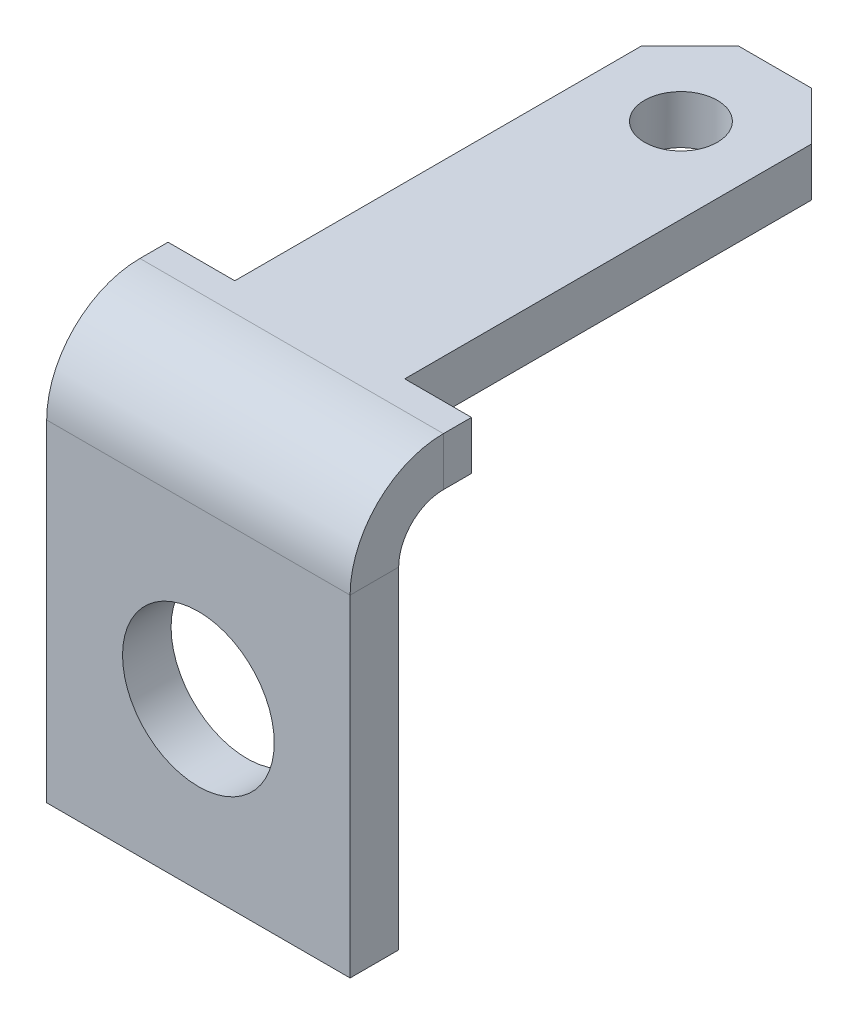
ISO-10303-21;
HEADER;
FILE_DESCRIPTION(('STEP AP214'),'2;1');
FILE_NAME('part.step','',(''),(''),'','','');
FILE_SCHEMA(('AUTOMOTIVE_DESIGN { 1 0 10303 214 1 1 1 1 }'));
ENDSEC;
DATA;
#1=APPLICATION_CONTEXT('core data for automotive mechanical design processes');
#2=APPLICATION_PROTOCOL_DEFINITION('international standard','automotive_design',2000,#1);
#3=PRODUCT_CONTEXT('',#1,'mechanical');
#4=PRODUCT('Part','Part','',(#3));
#5=PRODUCT_RELATED_PRODUCT_CATEGORY('part','',(#4));
#6=PRODUCT_DEFINITION_FORMATION('','',#4);
#7=PRODUCT_DEFINITION_CONTEXT('part definition',#1,'design');
#8=PRODUCT_DEFINITION('design','',#6,#7);
#9=PRODUCT_DEFINITION_SHAPE('','',#8);
#10=(LENGTH_UNIT() NAMED_UNIT(*) SI_UNIT(.MILLI.,.METRE.));
#11=(NAMED_UNIT(*) PLANE_ANGLE_UNIT() SI_UNIT($,.RADIAN.));
#12=(NAMED_UNIT(*) SI_UNIT($,.STERADIAN.) SOLID_ANGLE_UNIT());
#13=UNCERTAINTY_MEASURE_WITH_UNIT(LENGTH_MEASURE(1.E-05),#10,'distance_accuracy_value','');
#14=(GEOMETRIC_REPRESENTATION_CONTEXT(3) GLOBAL_UNCERTAINTY_ASSIGNED_CONTEXT((#13)) GLOBAL_UNIT_ASSIGNED_CONTEXT((#10,
#11,#12)) REPRESENTATION_CONTEXT('',''));
#15=CARTESIAN_POINT('',(0.,0.,0.));
#16=DIRECTION('',(0.,0.,1.));
#17=DIRECTION('',(1.,0.,0.));
#18=AXIS2_PLACEMENT_3D('',#15,#16,#17);
#19=CARTESIAN_POINT('',(2.5,3.5,-0.8));
#20=DIRECTION('',(1.,0.,0.));
#21=DIRECTION('',(0.,1.,0.));
#22=AXIS2_PLACEMENT_3D('',#19,#20,#21);
#23=PLANE('',#22);
#24=DIRECTION('',(0.,1.,0.));
#25=VECTOR('',#24,1.);
#26=CARTESIAN_POINT('',(2.5,3.5,-0.8));
#27=LINE('',#26,#25);
#28=CARTESIAN_POINT('',(2.5,-3.5,-0.8));
#29=VERTEX_POINT('',#28);
#30=CARTESIAN_POINT('',(2.5,1.9634,-0.8));
#31=VERTEX_POINT('',#30);
#32=EDGE_CURVE('E254',#29,#31,#27,.T.);
#33=ORIENTED_EDGE('',*,*,#32,.T.);
#34=DIRECTION('',(0.,0.,1.));
#35=VECTOR('',#34,1.);
#36=CARTESIAN_POINT('',(2.5,1.9634,-0.8));
#37=LINE('',#36,#35);
#38=CARTESIAN_POINT('',(2.5,1.9634,0.));
#39=VERTEX_POINT('',#38);
#40=EDGE_CURVE('E232',#31,#39,#37,.T.);
#41=ORIENTED_EDGE('',*,*,#40,.T.);
#42=DIRECTION('',(0.,1.,0.));
#43=VECTOR('',#42,1.);
#44=CARTESIAN_POINT('',(2.5,3.5,0.));
#45=LINE('',#44,#43);
#46=CARTESIAN_POINT('',(2.5,-3.5,0.));
#47=VERTEX_POINT('',#46);
#48=EDGE_CURVE('E251',#47,#39,#45,.T.);
#49=ORIENTED_EDGE('',*,*,#48,.F.);
#50=DIRECTION('',(0.,0.,1.));
#51=VECTOR('',#50,1.);
#52=CARTESIAN_POINT('',(2.5,-3.5,-0.8));
#53=LINE('',#52,#51);
#54=EDGE_CURVE('E264',#29,#47,#53,.T.);
#55=ORIENTED_EDGE('',*,*,#54,.F.);
#56=EDGE_LOOP('',(#33,#41,#49,#55));
#57=FACE_BOUND('',#56,.T.);
#58=ADVANCED_FACE('F57',(#57),#23,.T.);
#59=CARTESIAN_POINT('',(0.,0.,-0.8));
#60=DIRECTION('',(0.,0.,1.));
#61=DIRECTION('',(1.,0.,0.));
#62=AXIS2_PLACEMENT_3D('',#59,#60,#61);
#63=PLANE('',#62);
#64=CARTESIAN_POINT('',(0.,-0.768299999999999,-0.8));
#65=DIRECTION('',(0.,0.,-1.));
#66=DIRECTION('',(-1.,0.,0.));
#67=AXIS2_PLACEMENT_3D('',#64,#65,#66);
#68=CIRCLE('',#67,1.25);
#69=CARTESIAN_POINT('',(-1.25,-0.768299999999999,-0.8));
#70=VERTEX_POINT('',#69);
#71=EDGE_CURVE('E196',#70,#70,#68,.T.);
#72=ORIENTED_EDGE('',*,*,#71,.F.);
#73=EDGE_LOOP('',(#72));
#74=FACE_BOUND('',#73,.T.);
#75=DIRECTION('',(1.,0.,0.));
#76=VECTOR('',#75,1.);
#77=CARTESIAN_POINT('',(2.5,1.9634,-0.8));
#78=LINE('',#77,#76);
#79=CARTESIAN_POINT('',(-2.5,1.9634,-0.8));
#80=VERTEX_POINT('',#79);
#81=EDGE_CURVE('E238',#31,#80,#78,.F.);
#82=ORIENTED_EDGE('',*,*,#81,.F.);
#83=ORIENTED_EDGE('',*,*,#32,.F.);
#84=DIRECTION('',(1.,0.,0.));
#85=VECTOR('',#84,1.);
#86=CARTESIAN_POINT('',(-2.5,-3.5,-0.8));
#87=LINE('',#86,#85);
#88=CARTESIAN_POINT('',(-2.5,-3.5,-0.8));
#89=VERTEX_POINT('',#88);
#90=EDGE_CURVE('E250',#89,#29,#87,.T.);
#91=ORIENTED_EDGE('',*,*,#90,.F.);
#92=DIRECTION('',(0.,-1.,0.));
#93=VECTOR('',#92,1.);
#94=CARTESIAN_POINT('',(-2.5,3.5,-0.8));
#95=LINE('',#94,#93);
#96=EDGE_CURVE('E248',#80,#89,#95,.T.);
#97=ORIENTED_EDGE('',*,*,#96,.F.);
#98=EDGE_LOOP('',(#82,#83,#91,#97));
#99=FACE_BOUND('',#98,.T.);
#100=ADVANCED_FACE('F343',(#74,#99),#63,.F.);
#101=CARTESIAN_POINT('',(0.,0.,0.));
#102=DIRECTION('',(0.,0.,1.));
#103=DIRECTION('',(1.,0.,0.));
#104=AXIS2_PLACEMENT_3D('',#101,#102,#103);
#105=PLANE('',#104);
#106=CARTESIAN_POINT('',(0.,-0.768299999999999,0.));
#107=DIRECTION('',(0.,0.,1.));
#108=DIRECTION('',(1.,0.,0.));
#109=AXIS2_PLACEMENT_3D('',#106,#107,#108);
#110=CIRCLE('',#109,1.25);
#111=CARTESIAN_POINT('',(1.25,-0.768299999999999,0.));
#112=VERTEX_POINT('',#111);
#113=EDGE_CURVE('E199',#112,#112,#110,.T.);
#114=ORIENTED_EDGE('',*,*,#113,.F.);
#115=EDGE_LOOP('',(#114));
#116=FACE_BOUND('',#115,.T.);
#117=ORIENTED_EDGE('',*,*,#48,.T.);
#118=DIRECTION('',(1.,0.,0.));
#119=VECTOR('',#118,1.);
#120=CARTESIAN_POINT('',(2.5,1.9634,0.));
#121=LINE('',#120,#119);
#122=CARTESIAN_POINT('',(-2.5,1.9634,0.));
#123=VERTEX_POINT('',#122);
#124=EDGE_CURVE('E225',#39,#123,#121,.F.);
#125=ORIENTED_EDGE('',*,*,#124,.T.);
#126=DIRECTION('',(0.,-1.,0.));
#127=VECTOR('',#126,1.);
#128=CARTESIAN_POINT('',(-2.5,3.5,0.));
#129=LINE('',#128,#127);
#130=CARTESIAN_POINT('',(-2.5,-3.5,0.));
#131=VERTEX_POINT('',#130);
#132=EDGE_CURVE('E245',#123,#131,#129,.T.);
#133=ORIENTED_EDGE('',*,*,#132,.T.);
#134=DIRECTION('',(1.,0.,0.));
#135=VECTOR('',#134,1.);
#136=CARTESIAN_POINT('',(-2.5,-3.5,0.));
#137=LINE('',#136,#135);
#138=EDGE_CURVE('E259',#131,#47,#137,.T.);
#139=ORIENTED_EDGE('',*,*,#138,.T.);
#140=EDGE_LOOP('',(#117,#125,#133,#139));
#141=FACE_BOUND('',#140,.T.);
#142=ADVANCED_FACE('F325',(#116,#141),#105,.T.);
#143=CARTESIAN_POINT('',(-2.5,3.5,-0.8));
#144=DIRECTION('',(-1.,0.,0.));
#145=DIRECTION('',(0.,-1.,0.));
#146=AXIS2_PLACEMENT_3D('',#143,#144,#145);
#147=PLANE('',#146);
#148=DIRECTION('',(0.,0.,1.));
#149=VECTOR('',#148,1.);
#150=CARTESIAN_POINT('',(-2.5,1.9634,-0.8));
#151=LINE('',#150,#149);
#152=EDGE_CURVE('E242',#80,#123,#151,.T.);
#153=ORIENTED_EDGE('',*,*,#152,.F.);
#154=ORIENTED_EDGE('',*,*,#96,.T.);
#155=DIRECTION('',(0.,0.,1.));
#156=VECTOR('',#155,1.);
#157=CARTESIAN_POINT('',(-2.5,-3.5,-0.8));
#158=LINE('',#157,#156);
#159=EDGE_CURVE('E257',#89,#131,#158,.T.);
#160=ORIENTED_EDGE('',*,*,#159,.T.);
#161=ORIENTED_EDGE('',*,*,#132,.F.);
#162=EDGE_LOOP('',(#153,#154,#160,#161));
#163=FACE_BOUND('',#162,.T.);
#164=ADVANCED_FACE('F327',(#163),#147,.T.);
#165=CARTESIAN_POINT('',(-2.5,-3.5,-0.8));
#166=DIRECTION('',(0.,-1.,0.));
#167=DIRECTION('',(0.,0.,-1.));
#168=AXIS2_PLACEMENT_3D('',#165,#166,#167);
#169=PLANE('',#168);
#170=ORIENTED_EDGE('',*,*,#138,.F.);
#171=ORIENTED_EDGE('',*,*,#159,.F.);
#172=ORIENTED_EDGE('',*,*,#90,.T.);
#173=ORIENTED_EDGE('',*,*,#54,.T.);
#174=EDGE_LOOP('',(#170,#171,#172,#173));
#175=FACE_BOUND('',#174,.T.);
#176=ADVANCED_FACE('F332',(#175),#169,.T.);
#177=CARTESIAN_POINT('',(-2.5,1.9634,-1.5366));
#178=DIRECTION('',(-1.,0.,0.));
#179=DIRECTION('',(0.,0.,1.));
#180=AXIS2_PLACEMENT_3D('',#177,#178,#179);
#181=PLANE('',#180);
#182=DIRECTION('',(0.,-1.,0.));
#183=VECTOR('',#182,1.);
#184=CARTESIAN_POINT('',(-2.5,3.5,-1.53659999999999));
#185=LINE('',#184,#183);
#186=CARTESIAN_POINT('',(-2.5,2.7,-1.5366));
#187=VERTEX_POINT('',#186);
#188=CARTESIAN_POINT('',(-2.5,3.5,-1.53659999999999));
#189=VERTEX_POINT('',#188);
#190=EDGE_CURVE('E222',#187,#189,#185,.F.);
#191=ORIENTED_EDGE('',*,*,#190,.F.);
#192=CARTESIAN_POINT('',(-2.5,1.9634,-1.5366));
#193=DIRECTION('',(1.,0.,0.));
#194=DIRECTION('',(0.,0.,-1.));
#195=AXIS2_PLACEMENT_3D('',#192,#193,#194);
#196=CIRCLE('',#195,0.7366);
#197=EDGE_CURVE('E235',#80,#187,#196,.F.);
#198=ORIENTED_EDGE('',*,*,#197,.F.);
#199=ORIENTED_EDGE('',*,*,#152,.T.);
#200=CARTESIAN_POINT('',(-2.5,1.9634,-1.5366));
#201=DIRECTION('',(1.,0.,0.));
#202=DIRECTION('',(0.,0.,-1.));
#203=AXIS2_PLACEMENT_3D('',#200,#201,#202);
#204=CIRCLE('',#203,1.5366);
#205=EDGE_CURVE('E228',#123,#189,#204,.F.);
#206=ORIENTED_EDGE('',*,*,#205,.T.);
#207=EDGE_LOOP('',(#191,#198,#199,#206));
#208=FACE_BOUND('',#207,.T.);
#209=ADVANCED_FACE('F318',(#208),#181,.T.);
#210=CARTESIAN_POINT('',(2.5,1.9634,-1.5366));
#211=DIRECTION('',(-1.,0.,0.));
#212=DIRECTION('',(0.,0.,1.));
#213=AXIS2_PLACEMENT_3D('',#210,#211,#212);
#214=PLANE('',#213);
#215=CARTESIAN_POINT('',(2.5,1.9634,-1.5366));
#216=DIRECTION('',(1.,0.,0.));
#217=DIRECTION('',(0.,0.,-1.));
#218=AXIS2_PLACEMENT_3D('',#215,#216,#217);
#219=CIRCLE('',#218,0.7366);
#220=CARTESIAN_POINT('',(2.5,2.7,-1.5366));
#221=VERTEX_POINT('',#220);
#222=EDGE_CURVE('E202',#221,#31,#219,.T.);
#223=ORIENTED_EDGE('',*,*,#222,.F.);
#224=DIRECTION('',(0.,-1.,0.));
#225=VECTOR('',#224,1.);
#226=CARTESIAN_POINT('',(2.5,2.7,-1.5366));
#227=LINE('',#226,#225);
#228=CARTESIAN_POINT('',(2.5,3.5,-1.53659999999999));
#229=VERTEX_POINT('',#228);
#230=EDGE_CURVE('E217',#221,#229,#227,.F.);
#231=ORIENTED_EDGE('',*,*,#230,.T.);
#232=CARTESIAN_POINT('',(2.5,1.9634,-1.5366));
#233=DIRECTION('',(1.,0.,0.));
#234=DIRECTION('',(0.,0.,-1.));
#235=AXIS2_PLACEMENT_3D('',#232,#233,#234);
#236=CIRCLE('',#235,1.5366);
#237=EDGE_CURVE('E229',#229,#39,#236,.T.);
#238=ORIENTED_EDGE('',*,*,#237,.T.);
#239=ORIENTED_EDGE('',*,*,#40,.F.);
#240=EDGE_LOOP('',(#223,#231,#238,#239));
#241=FACE_BOUND('',#240,.T.);
#242=ADVANCED_FACE('F337',(#241),#214,.F.);
#243=CARTESIAN_POINT('',(2.5,1.9634,-1.5366));
#244=DIRECTION('',(1.,0.,0.));
#245=DIRECTION('',(0.,1.,0.));
#246=AXIS2_PLACEMENT_3D('',#243,#244,#245);
#247=CYLINDRICAL_SURFACE('',#246,1.5366);
#248=ORIENTED_EDGE('',*,*,#124,.F.);
#249=ORIENTED_EDGE('',*,*,#237,.F.);
#250=DIRECTION('',(1.,0.,0.));
#251=VECTOR('',#250,1.);
#252=CARTESIAN_POINT('',(-2.5,3.5,-1.53659999999999));
#253=LINE('',#252,#251);
#254=EDGE_CURVE('E214',#229,#189,#253,.F.);
#255=ORIENTED_EDGE('',*,*,#254,.T.);
#256=ORIENTED_EDGE('',*,*,#205,.F.);
#257=EDGE_LOOP('',(#248,#249,#255,#256));
#258=FACE_BOUND('',#257,.T.);
#259=ADVANCED_FACE('F316',(#258),#247,.T.);
#260=CARTESIAN_POINT('',(2.5,1.9634,-1.5366));
#261=DIRECTION('',(1.,0.,0.));
#262=DIRECTION('',(0.,1.,0.));
#263=AXIS2_PLACEMENT_3D('',#260,#261,#262);
#264=CYLINDRICAL_SURFACE('',#263,0.7366);
#265=ORIENTED_EDGE('',*,*,#81,.T.);
#266=ORIENTED_EDGE('',*,*,#197,.T.);
#267=DIRECTION('',(1.,0.,0.));
#268=VECTOR('',#267,1.);
#269=CARTESIAN_POINT('',(-2.5,2.7,-1.5366));
#270=LINE('',#269,#268);
#271=EDGE_CURVE('E220',#187,#221,#270,.T.);
#272=ORIENTED_EDGE('',*,*,#271,.T.);
#273=ORIENTED_EDGE('',*,*,#222,.T.);
#274=EDGE_LOOP('',(#265,#266,#272,#273));
#275=FACE_BOUND('',#274,.T.);
#276=ADVANCED_FACE('F341',(#275),#264,.F.);
#277=CARTESIAN_POINT('',(2.5,3.50000000000003,-9.5));
#278=DIRECTION('',(-1.,0.,0.));
#279=DIRECTION('',(0.,0.,1.));
#280=AXIS2_PLACEMENT_3D('',#277,#278,#279);
#281=PLANE('',#280);
#282=DIRECTION('',(0.,0.,1.));
#283=VECTOR('',#282,1.);
#284=CARTESIAN_POINT('',(2.5,2.70000000000003,-9.5));
#285=LINE('',#284,#283);
#286=CARTESIAN_POINT('',(2.5,2.7,-2.));
#287=VERTEX_POINT('',#286);
#288=EDGE_CURVE('E211',#221,#287,#285,.F.);
#289=ORIENTED_EDGE('',*,*,#288,.T.);
#290=DIRECTION('',(0.,1.,0.));
#291=VECTOR('',#290,1.);
#292=CARTESIAN_POINT('',(2.5,-6.5,-2.00000000000003));
#293=LINE('',#292,#291);
#294=CARTESIAN_POINT('',(2.5,3.5,-2.));
#295=VERTEX_POINT('',#294);
#296=EDGE_CURVE('E172',#287,#295,#293,.T.);
#297=ORIENTED_EDGE('',*,*,#296,.T.);
#298=DIRECTION('',(0.,0.,-1.));
#299=VECTOR('',#298,1.);
#300=CARTESIAN_POINT('',(2.5,3.5,0.));
#301=LINE('',#300,#299);
#302=EDGE_CURVE('E178',#229,#295,#301,.T.);
#303=ORIENTED_EDGE('',*,*,#302,.F.);
#304=ORIENTED_EDGE('',*,*,#230,.F.);
#305=EDGE_LOOP('',(#289,#297,#303,#304));
#306=FACE_BOUND('',#305,.T.);
#307=ADVANCED_FACE('F393',(#306),#281,.F.);
#308=CARTESIAN_POINT('',(-2.5,3.5,-0.799999999999997));
#309=DIRECTION('',(1.,0.,0.));
#310=DIRECTION('',(0.,0.,-1.));
#311=AXIS2_PLACEMENT_3D('',#308,#309,#310);
#312=PLANE('',#311);
#313=DIRECTION('',(0.,0.,1.));
#314=VECTOR('',#313,1.);
#315=CARTESIAN_POINT('',(-2.5,3.5,0.));
#316=LINE('',#315,#314);
#317=CARTESIAN_POINT('',(-2.5,3.5,-2.));
#318=VERTEX_POINT('',#317);
#319=EDGE_CURVE('E200',#318,#189,#316,.T.);
#320=ORIENTED_EDGE('',*,*,#319,.F.);
#321=DIRECTION('',(0.,1.,0.));
#322=VECTOR('',#321,1.);
#323=CARTESIAN_POINT('',(-2.5,-6.5,-2.00000000000003));
#324=LINE('',#323,#322);
#325=CARTESIAN_POINT('',(-2.5,2.7,-2.));
#326=VERTEX_POINT('',#325);
#327=EDGE_CURVE('E190',#326,#318,#324,.T.);
#328=ORIENTED_EDGE('',*,*,#327,.F.);
#329=DIRECTION('',(0.,0.,-1.));
#330=VECTOR('',#329,1.);
#331=CARTESIAN_POINT('',(-2.5,2.7,-0.8));
#332=LINE('',#331,#330);
#333=EDGE_CURVE('E206',#326,#187,#332,.F.);
#334=ORIENTED_EDGE('',*,*,#333,.T.);
#335=ORIENTED_EDGE('',*,*,#190,.T.);
#336=EDGE_LOOP('',(#320,#328,#334,#335));
#337=FACE_BOUND('',#336,.T.);
#338=ADVANCED_FACE('F313',(#337),#312,.F.);
#339=CARTESIAN_POINT('',(0.,3.5,0.));
#340=DIRECTION('',(0.,-1.,0.));
#341=DIRECTION('',(0.,0.,-1.));
#342=AXIS2_PLACEMENT_3D('',#339,#340,#341);
#343=PLANE('',#342);
#344=CARTESIAN_POINT('',(0.,3.50000000000003,-7.95129225282023));
#345=DIRECTION('',(0.,1.,0.));
#346=DIRECTION('',(0.,0.,1.));
#347=AXIS2_PLACEMENT_3D('',#344,#345,#346);
#348=CIRCLE('',#347,0.6);
#349=CARTESIAN_POINT('',(0.,3.50000000000002,-7.35129225282023));
#350=VERTEX_POINT('',#349);
#351=EDGE_CURVE('E276',#350,#350,#348,.T.);
#352=ORIENTED_EDGE('',*,*,#351,.F.);
#353=EDGE_LOOP('',(#352));
#354=FACE_BOUND('',#353,.T.);
#355=DIRECTION('',(0.,0.,1.));
#356=VECTOR('',#355,1.);
#357=CARTESIAN_POINT('',(1.4,3.50000000000003,-9.5));
#358=LINE('',#357,#356);
#359=CARTESIAN_POINT('',(1.4,3.50000000000003,-8.7));
#360=VERTEX_POINT('',#359);
#361=CARTESIAN_POINT('',(1.4,3.5,-2.));
#362=VERTEX_POINT('',#361);
#363=EDGE_CURVE('E157',#360,#362,#358,.T.);
#364=ORIENTED_EDGE('',*,*,#363,.F.);
#365=DIRECTION('',(0.707106781186546,0.,0.707106781186549));
#366=VECTOR('',#365,1.);
#367=CARTESIAN_POINT('',(0.599999999999999,3.50000000000003,-9.5));
#368=LINE('',#367,#366);
#369=CARTESIAN_POINT('',(0.599999999999999,3.50000000000003,-9.5));
#370=VERTEX_POINT('',#369);
#371=EDGE_CURVE('E65',#360,#370,#368,.F.);
#372=ORIENTED_EDGE('',*,*,#371,.T.);
#373=DIRECTION('',(-1.,0.,0.));
#374=VECTOR('',#373,1.);
#375=CARTESIAN_POINT('',(0.,3.50000000000003,-9.5));
#376=LINE('',#375,#374);
#377=CARTESIAN_POINT('',(-0.599999999999999,3.50000000000003,-9.5));
#378=VERTEX_POINT('',#377);
#379=EDGE_CURVE('E203',#370,#378,#376,.T.);
#380=ORIENTED_EDGE('',*,*,#379,.T.);
#381=DIRECTION('',(0.707106781186546,0.,-0.707106781186549));
#382=VECTOR('',#381,1.);
#383=CARTESIAN_POINT('',(-0.599999999999999,3.50000000000003,-9.5));
#384=LINE('',#383,#382);
#385=CARTESIAN_POINT('',(-1.4,3.50000000000003,-8.69999999999999));
#386=VERTEX_POINT('',#385);
#387=EDGE_CURVE('E72',#378,#386,#384,.F.);
#388=ORIENTED_EDGE('',*,*,#387,.T.);
#389=DIRECTION('',(0.,0.,-1.));
#390=VECTOR('',#389,1.);
#391=CARTESIAN_POINT('',(-1.4,3.50000000000003,-9.5));
#392=LINE('',#391,#390);
#393=CARTESIAN_POINT('',(-1.4,3.5,-2.));
#394=VERTEX_POINT('',#393);
#395=EDGE_CURVE('E188',#394,#386,#392,.T.);
#396=ORIENTED_EDGE('',*,*,#395,.F.);
#397=DIRECTION('',(1.,0.,0.));
#398=VECTOR('',#397,1.);
#399=CARTESIAN_POINT('',(-2.5,3.5,-2.));
#400=LINE('',#399,#398);
#401=EDGE_CURVE('E185',#318,#394,#400,.T.);
#402=ORIENTED_EDGE('',*,*,#401,.F.);
#403=ORIENTED_EDGE('',*,*,#319,.T.);
#404=ORIENTED_EDGE('',*,*,#254,.F.);
#405=ORIENTED_EDGE('',*,*,#302,.T.);
#406=DIRECTION('',(1.,0.,0.));
#407=VECTOR('',#406,1.);
#408=CARTESIAN_POINT('',(2.5,3.5,-2.));
#409=LINE('',#408,#407);
#410=EDGE_CURVE('E164',#362,#295,#409,.T.);
#411=ORIENTED_EDGE('',*,*,#410,.F.);
#412=EDGE_LOOP('',(#364,#372,#380,#388,#396,#402,#403,#404,#405,#411));
#413=FACE_BOUND('',#412,.T.);
#414=ADVANCED_FACE('F175',(#354,#413),#343,.F.);
#415=CARTESIAN_POINT('',(0.,2.7,0.));
#416=DIRECTION('',(0.,-1.,0.));
#417=DIRECTION('',(0.,0.,-1.));
#418=AXIS2_PLACEMENT_3D('',#415,#416,#417);
#419=PLANE('',#418);
#420=CARTESIAN_POINT('',(0.,2.70000000000003,-7.95129225282023));
#421=DIRECTION('',(0.,-1.,0.));
#422=DIRECTION('',(0.,0.,-1.));
#423=AXIS2_PLACEMENT_3D('',#420,#421,#422);
#424=CIRCLE('',#423,0.6);
#425=CARTESIAN_POINT('',(0.,2.70000000000003,-8.55129225282023));
#426=VERTEX_POINT('',#425);
#427=EDGE_CURVE('E165',#426,#426,#424,.T.);
#428=ORIENTED_EDGE('',*,*,#427,.F.);
#429=EDGE_LOOP('',(#428));
#430=FACE_BOUND('',#429,.T.);
#431=DIRECTION('',(1.,0.,0.));
#432=VECTOR('',#431,1.);
#433=CARTESIAN_POINT('',(-2.5,2.70000000000003,-9.5));
#434=LINE('',#433,#432);
#435=CARTESIAN_POINT('',(0.599999999999999,2.70000000000003,-9.50000000000001));
#436=VERTEX_POINT('',#435);
#437=CARTESIAN_POINT('',(-0.599999999999999,2.70000000000003,-9.50000000000001));
#438=VERTEX_POINT('',#437);
#439=EDGE_CURVE('E208',#436,#438,#434,.F.);
#440=ORIENTED_EDGE('',*,*,#439,.F.);
#441=DIRECTION('',(-0.707106781186546,0.,-0.707106781186549));
#442=VECTOR('',#441,1.);
#443=CARTESIAN_POINT('',(5.05000000000001,2.70000000000002,-5.04999999999997));
#444=LINE('',#443,#442);
#445=CARTESIAN_POINT('',(1.4,2.70000000000003,-8.7));
#446=VERTEX_POINT('',#445);
#447=EDGE_CURVE('E284',#436,#446,#444,.F.);
#448=ORIENTED_EDGE('',*,*,#447,.T.);
#449=DIRECTION('',(0.,0.,-1.));
#450=VECTOR('',#449,1.);
#451=CARTESIAN_POINT('',(1.4,2.7,0.));
#452=LINE('',#451,#450);
#453=CARTESIAN_POINT('',(1.4,2.70000000000002,-2.));
#454=VERTEX_POINT('',#453);
#455=EDGE_CURVE('E182',#454,#446,#452,.T.);
#456=ORIENTED_EDGE('',*,*,#455,.F.);
#457=DIRECTION('',(-1.,0.,0.));
#458=VECTOR('',#457,1.);
#459=CARTESIAN_POINT('',(0.,2.7,-2.));
#460=LINE('',#459,#458);
#461=EDGE_CURVE('E171',#287,#454,#460,.T.);
#462=ORIENTED_EDGE('',*,*,#461,.F.);
#463=ORIENTED_EDGE('',*,*,#288,.F.);
#464=ORIENTED_EDGE('',*,*,#271,.F.);
#465=ORIENTED_EDGE('',*,*,#333,.F.);
#466=DIRECTION('',(-1.,0.,0.));
#467=VECTOR('',#466,1.);
#468=CARTESIAN_POINT('',(0.,2.7,-2.));
#469=LINE('',#468,#467);
#470=CARTESIAN_POINT('',(-1.4,2.7,-2.));
#471=VERTEX_POINT('',#470);
#472=EDGE_CURVE('E266',#471,#326,#469,.T.);
#473=ORIENTED_EDGE('',*,*,#472,.F.);
#474=DIRECTION('',(0.,0.,1.));
#475=VECTOR('',#474,1.);
#476=CARTESIAN_POINT('',(-1.4,2.7,0.));
#477=LINE('',#476,#475);
#478=CARTESIAN_POINT('',(-1.4,2.70000000000003,-8.7));
#479=VERTEX_POINT('',#478);
#480=EDGE_CURVE('E193',#479,#471,#477,.T.);
#481=ORIENTED_EDGE('',*,*,#480,.F.);
#482=DIRECTION('',(-0.707106781186546,0.,0.707106781186549));
#483=VECTOR('',#482,1.);
#484=CARTESIAN_POINT('',(-5.05000000000001,2.70000000000002,-5.04999999999997));
#485=LINE('',#484,#483);
#486=EDGE_CURVE('E282',#479,#438,#485,.F.);
#487=ORIENTED_EDGE('',*,*,#486,.T.);
#488=EDGE_LOOP('',(#440,#448,#456,#462,#463,#464,#465,#473,#481,#487));
#489=FACE_BOUND('',#488,.T.);
#490=ADVANCED_FACE('F296',(#430,#489),#419,.T.);
#491=CARTESIAN_POINT('',(-2.5,3.50000000000003,-9.5));
#492=DIRECTION('',(0.,0.,1.));
#493=DIRECTION('',(0.,-1.,0.));
#494=AXIS2_PLACEMENT_3D('',#491,#492,#493);
#495=PLANE('',#494);
#496=ORIENTED_EDGE('',*,*,#379,.F.);
#497=DIRECTION('',(0.,-1.,0.));
#498=VECTOR('',#497,1.);
#499=CARTESIAN_POINT('',(0.599999999999999,3.50000000000003,-9.5));
#500=LINE('',#499,#498);
#501=EDGE_CURVE('E279',#370,#436,#500,.T.);
#502=ORIENTED_EDGE('',*,*,#501,.T.);
#503=ORIENTED_EDGE('',*,*,#439,.T.);
#504=DIRECTION('',(0.,1.,0.));
#505=VECTOR('',#504,1.);
#506=CARTESIAN_POINT('',(-0.599999999999999,3.50000000000003,-9.5));
#507=LINE('',#506,#505);
#508=EDGE_CURVE('E273',#438,#378,#507,.T.);
#509=ORIENTED_EDGE('',*,*,#508,.T.);
#510=EDGE_LOOP('',(#496,#502,#503,#509));
#511=FACE_BOUND('',#510,.T.);
#512=ADVANCED_FACE('F291',(#511),#495,.F.);
#513=CARTESIAN_POINT('',(0.,-0.768299999999999,9.2));
#514=DIRECTION('',(0.,0.,-1.));
#515=DIRECTION('',(-1.,0.,0.));
#516=AXIS2_PLACEMENT_3D('',#513,#514,#515);
#517=CYLINDRICAL_SURFACE('',#516,1.25);
#518=ORIENTED_EDGE('',*,*,#113,.T.);
#519=EDGE_LOOP('',(#518));
#520=FACE_BOUND('',#519,.T.);
#521=ORIENTED_EDGE('',*,*,#71,.T.);
#522=EDGE_LOOP('',(#521));
#523=FACE_BOUND('',#522,.T.);
#524=ADVANCED_FACE('F379',(#520,#523),#517,.F.);
#525=CARTESIAN_POINT('',(-1.4,-6.49999999999997,-9.50000000000003));
#526=DIRECTION('',(1.,0.,0.));
#527=DIRECTION('',(0.,0.,-1.));
#528=AXIS2_PLACEMENT_3D('',#525,#526,#527);
#529=PLANE('',#528);
#530=ORIENTED_EDGE('',*,*,#395,.T.);
#531=DIRECTION('',(0.,-1.,0.));
#532=VECTOR('',#531,1.);
#533=CARTESIAN_POINT('',(-1.4,-6.49999999999997,-8.70000000000003));
#534=LINE('',#533,#532);
#535=EDGE_CURVE('E13',#386,#479,#534,.T.);
#536=ORIENTED_EDGE('',*,*,#535,.T.);
#537=ORIENTED_EDGE('',*,*,#480,.T.);
#538=DIRECTION('',(0.,1.,0.));
#539=VECTOR('',#538,1.);
#540=CARTESIAN_POINT('',(-1.4,-6.5,-2.00000000000003));
#541=LINE('',#540,#539);
#542=EDGE_CURVE('E191',#471,#394,#541,.T.);
#543=ORIENTED_EDGE('',*,*,#542,.T.);
#544=EDGE_LOOP('',(#530,#536,#537,#543));
#545=FACE_BOUND('',#544,.T.);
#546=ADVANCED_FACE('F302',(#545),#529,.F.);
#547=CARTESIAN_POINT('',(-2.5,-6.5,-2.00000000000003));
#548=DIRECTION('',(0.,0.,1.));
#549=DIRECTION('',(0.,-1.,0.));
#550=AXIS2_PLACEMENT_3D('',#547,#548,#549);
#551=PLANE('',#550);
#552=ORIENTED_EDGE('',*,*,#472,.T.);
#553=ORIENTED_EDGE('',*,*,#327,.T.);
#554=ORIENTED_EDGE('',*,*,#401,.T.);
#555=ORIENTED_EDGE('',*,*,#542,.F.);
#556=EDGE_LOOP('',(#552,#553,#554,#555));
#557=FACE_BOUND('',#556,.T.);
#558=ADVANCED_FACE('F309',(#557),#551,.F.);
#559=CARTESIAN_POINT('',(2.5,-6.5,-2.00000000000003));
#560=DIRECTION('',(0.,0.,1.));
#561=DIRECTION('',(0.,-1.,0.));
#562=AXIS2_PLACEMENT_3D('',#559,#560,#561);
#563=PLANE('',#562);
#564=ORIENTED_EDGE('',*,*,#461,.T.);
#565=DIRECTION('',(0.,1.,0.));
#566=VECTOR('',#565,1.);
#567=CARTESIAN_POINT('',(1.4,-6.5,-2.00000000000003));
#568=LINE('',#567,#566);
#569=EDGE_CURVE('E160',#454,#362,#568,.T.);
#570=ORIENTED_EDGE('',*,*,#569,.T.);
#571=ORIENTED_EDGE('',*,*,#410,.T.);
#572=ORIENTED_EDGE('',*,*,#296,.F.);
#573=EDGE_LOOP('',(#564,#570,#571,#572));
#574=FACE_BOUND('',#573,.T.);
#575=ADVANCED_FACE('F168',(#574),#563,.F.);
#576=CARTESIAN_POINT('',(1.4,-6.49999999999997,-9.50000000000003));
#577=DIRECTION('',(-1.,0.,0.));
#578=DIRECTION('',(0.,0.,1.));
#579=AXIS2_PLACEMENT_3D('',#576,#577,#578);
#580=PLANE('',#579);
#581=ORIENTED_EDGE('',*,*,#455,.T.);
#582=DIRECTION('',(0.,1.,0.));
#583=VECTOR('',#582,1.);
#584=CARTESIAN_POINT('',(1.4,-6.49999999999997,-8.70000000000003));
#585=LINE('',#584,#583);
#586=EDGE_CURVE('E80',#446,#360,#585,.T.);
#587=ORIENTED_EDGE('',*,*,#586,.T.);
#588=ORIENTED_EDGE('',*,*,#363,.T.);
#589=ORIENTED_EDGE('',*,*,#569,.F.);
#590=EDGE_LOOP('',(#581,#587,#588,#589));
#591=FACE_BOUND('',#590,.T.);
#592=ADVANCED_FACE('F159',(#591),#580,.F.);
#593=CARTESIAN_POINT('',(0.,-6.49999999999997,-7.95129225282026));
#594=DIRECTION('',(0.,1.,0.));
#595=DIRECTION('',(0.,0.,1.));
#596=AXIS2_PLACEMENT_3D('',#593,#594,#595);
#597=CYLINDRICAL_SURFACE('',#596,0.6);
#598=ORIENTED_EDGE('',*,*,#427,.T.);
#599=EDGE_LOOP('',(#598));
#600=FACE_BOUND('',#599,.T.);
#601=ORIENTED_EDGE('',*,*,#351,.T.);
#602=EDGE_LOOP('',(#601));
#603=FACE_BOUND('',#602,.T.);
#604=ADVANCED_FACE('F362',(#600,#603),#597,.F.);
#605=CARTESIAN_POINT('',(0.599999999999999,3.50000000000003,-9.5));
#606=DIRECTION('',(-0.707106781186549,0.,0.707106781186546));
#607=DIRECTION('',(0.,-1.,0.));
#608=AXIS2_PLACEMENT_3D('',#605,#606,#607);
#609=PLANE('',#608);
#610=ORIENTED_EDGE('',*,*,#371,.F.);
#611=ORIENTED_EDGE('',*,*,#586,.F.);
#612=ORIENTED_EDGE('',*,*,#447,.F.);
#613=ORIENTED_EDGE('',*,*,#501,.F.);
#614=EDGE_LOOP('',(#610,#611,#612,#613));
#615=FACE_BOUND('',#614,.T.);
#616=ADVANCED_FACE('F294',(#615),#609,.F.);
#617=CARTESIAN_POINT('',(-0.599999999999999,3.50000000000003,-9.5));
#618=DIRECTION('',(0.707106781186549,0.,0.707106781186546));
#619=DIRECTION('',(0.,1.,0.));
#620=AXIS2_PLACEMENT_3D('',#617,#618,#619);
#621=PLANE('',#620);
#622=ORIENTED_EDGE('',*,*,#486,.F.);
#623=ORIENTED_EDGE('',*,*,#535,.F.);
#624=ORIENTED_EDGE('',*,*,#387,.F.);
#625=ORIENTED_EDGE('',*,*,#508,.F.);
#626=EDGE_LOOP('',(#622,#623,#624,#625));
#627=FACE_BOUND('',#626,.T.);
#628=ADVANCED_FACE('F59',(#627),#621,.F.);
#629=CLOSED_SHELL('',(#58,#100,#142,#164,#176,#209,#242,#259,#276,#307,#338,#414,#490,#512,#524,
#546,#558,#575,#592,#604,#616,#628));
#630=MANIFOLD_SOLID_BREP('B2',#629);
#631=ADVANCED_BREP_SHAPE_REPRESENTATION('',(#18,#630),#14);
#632=SHAPE_DEFINITION_REPRESENTATION(#9,#631);
ENDSEC;
END-ISO-10303-21;
